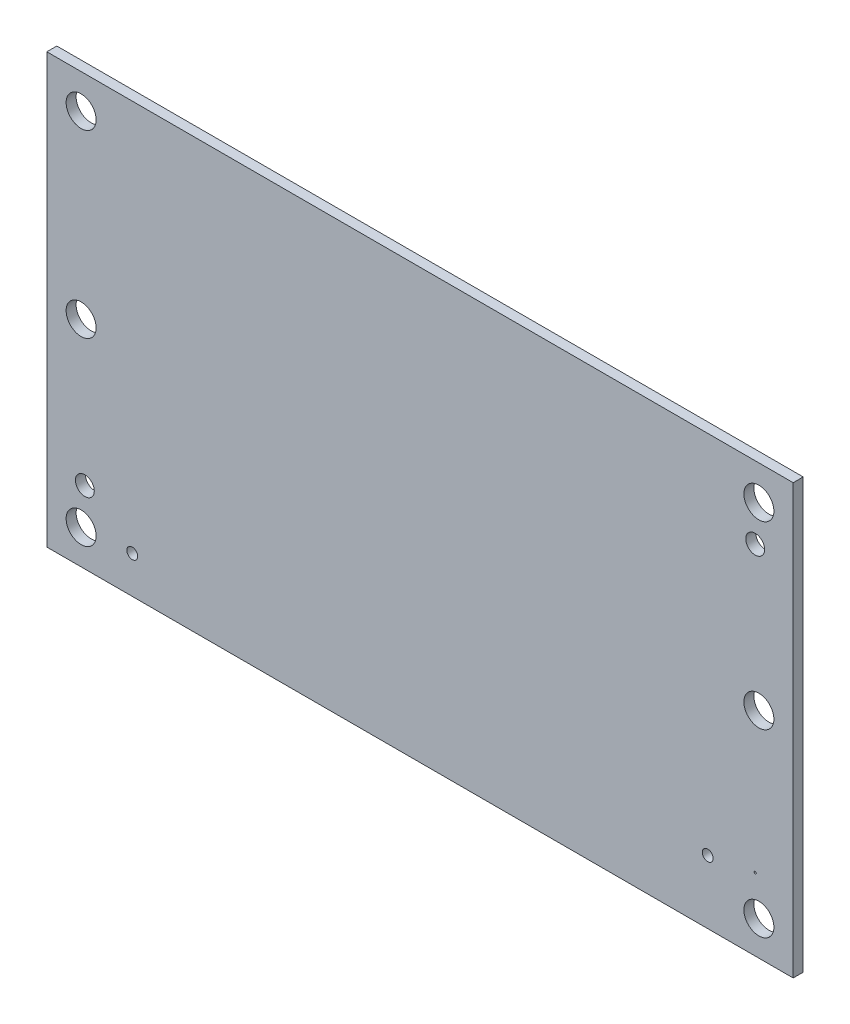
ISO-10303-21;
HEADER;
FILE_DESCRIPTION(('STEP AP214'),'2;1');
FILE_NAME('part.step','',(''),(''),'','','');
FILE_SCHEMA(('AUTOMOTIVE_DESIGN { 1 0 10303 214 1 1 1 1 }'));
ENDSEC;
DATA;
#1=APPLICATION_CONTEXT('core data for automotive mechanical design processes');
#2=APPLICATION_PROTOCOL_DEFINITION('international standard','automotive_design',2000,#1);
#3=PRODUCT_CONTEXT('',#1,'mechanical');
#4=PRODUCT('Part','Part','',(#3));
#5=PRODUCT_RELATED_PRODUCT_CATEGORY('part','',(#4));
#6=PRODUCT_DEFINITION_FORMATION('','',#4);
#7=PRODUCT_DEFINITION_CONTEXT('part definition',#1,'design');
#8=PRODUCT_DEFINITION('design','',#6,#7);
#9=PRODUCT_DEFINITION_SHAPE('','',#8);
#10=(LENGTH_UNIT() NAMED_UNIT(*) SI_UNIT(.MILLI.,.METRE.));
#11=(NAMED_UNIT(*) PLANE_ANGLE_UNIT() SI_UNIT($,.RADIAN.));
#12=(NAMED_UNIT(*) SI_UNIT($,.STERADIAN.) SOLID_ANGLE_UNIT());
#13=UNCERTAINTY_MEASURE_WITH_UNIT(LENGTH_MEASURE(1.E-05),#10,'distance_accuracy_value','');
#14=(GEOMETRIC_REPRESENTATION_CONTEXT(3) GLOBAL_UNCERTAINTY_ASSIGNED_CONTEXT((#13)) GLOBAL_UNIT_ASSIGNED_CONTEXT((#10,
#11,#12)) REPRESENTATION_CONTEXT('',''));
#15=CARTESIAN_POINT('',(0.,0.,0.));
#16=DIRECTION('',(0.,0.,1.));
#17=DIRECTION('',(1.,0.,0.));
#18=AXIS2_PLACEMENT_3D('',#15,#16,#17);
#19=CARTESIAN_POINT('',(0.,0.,1.16399999999992));
#20=DIRECTION('',(0.,0.,1.));
#21=DIRECTION('',(1.,0.,0.));
#22=AXIS2_PLACEMENT_3D('',#19,#20,#21);
#23=PLANE('',#22);
#24=CARTESIAN_POINT('',(5.9599999926,0.3500000112,1.16399999999992));
#25=DIRECTION('',(0.,0.,1.));
#26=DIRECTION('',(1.,0.,0.));
#27=AXIS2_PLACEMENT_3D('',#24,#25,#26);
#28=CIRCLE('',#27,0.635);
#29=CARTESIAN_POINT('',(6.5949999926,0.3500000112,1.16399999999992));
#30=VERTEX_POINT('',#29);
#31=EDGE_CURVE('E113',#30,#30,#28,.F.);
#32=ORIENTED_EDGE('',*,*,#31,.T.);
#33=EDGE_LOOP('',(#32));
#34=FACE_BOUND('',#33,.T.);
#35=CARTESIAN_POINT('',(73.0399999954,3.4000000072,1.16399999999992));
#36=DIRECTION('',(0.,0.,1.));
#37=DIRECTION('',(1.,0.,0.));
#38=AXIS2_PLACEMENT_3D('',#35,#36,#37);
#39=CIRCLE('',#38,0.635);
#40=CARTESIAN_POINT('',(73.6749999954,3.4000000072,1.16399999999992));
#41=VERTEX_POINT('',#40);
#42=EDGE_CURVE('E116',#41,#41,#39,.F.);
#43=ORIENTED_EDGE('',*,*,#42,.T.);
#44=EDGE_LOOP('',(#43));
#45=FACE_BOUND('',#44,.T.);
#46=CARTESIAN_POINT('',(78.5700000098,4.4300000046,1.16399999999992));
#47=DIRECTION('',(0.,0.,1.));
#48=DIRECTION('',(1.,0.,0.));
#49=AXIS2_PLACEMENT_3D('',#46,#47,#48);
#50=CIRCLE('',#49,0.125000004);
#51=CARTESIAN_POINT('',(78.6950000138,4.4300000046,1.16399999999992));
#52=VERTEX_POINT('',#51);
#53=EDGE_CURVE('E119',#52,#52,#50,.F.);
#54=ORIENTED_EDGE('',*,*,#53,.T.);
#55=EDGE_LOOP('',(#54));
#56=FACE_BOUND('',#55,.T.);
#57=CARTESIAN_POINT('',(78.5700000098,37.5799999986,1.16399999999992));
#58=DIRECTION('',(0.,0.,1.));
#59=DIRECTION('',(1.,0.,0.));
#60=AXIS2_PLACEMENT_3D('',#57,#58,#59);
#61=CIRCLE('',#60,1.0999999971);
#62=CARTESIAN_POINT('',(79.6700000069,37.5799999986,1.16399999999992));
#63=VERTEX_POINT('',#62);
#64=EDGE_CURVE('E122',#63,#63,#61,.F.);
#65=ORIENTED_EDGE('',*,*,#64,.T.);
#66=EDGE_LOOP('',(#65));
#67=FACE_BOUND('',#66,.T.);
#68=CARTESIAN_POINT('',(0.4319999996,4.4180000032,1.16399999999992));
#69=DIRECTION('',(0.,0.,1.));
#70=DIRECTION('',(1.,0.,0.));
#71=AXIS2_PLACEMENT_3D('',#68,#69,#70);
#72=CIRCLE('',#71,1.0999999971);
#73=CARTESIAN_POINT('',(1.5319999967,4.4180000032,1.16399999999992));
#74=VERTEX_POINT('',#73);
#75=EDGE_CURVE('E125',#74,#74,#72,.F.);
#76=ORIENTED_EDGE('',*,*,#75,.T.);
#77=EDGE_LOOP('',(#76));
#78=FACE_BOUND('',#77,.T.);
#79=CARTESIAN_POINT('',(78.999999988,41.9999999978,1.16399999999992));
#80=DIRECTION('',(0.,0.,1.));
#81=DIRECTION('',(1.,0.,0.));
#82=AXIS2_PLACEMENT_3D('',#79,#80,#81);
#83=CIRCLE('',#82,1.7500000052);
#84=CARTESIAN_POINT('',(80.7499999932,41.9999999978,1.16399999999992));
#85=VERTEX_POINT('',#84);
#86=EDGE_CURVE('E128',#85,#85,#83,.F.);
#87=ORIENTED_EDGE('',*,*,#86,.T.);
#88=EDGE_LOOP('',(#87));
#89=FACE_BOUND('',#88,.T.);
#90=CARTESIAN_POINT('',(78.999999988,21.0000000116,1.16399999999992));
#91=DIRECTION('',(0.,0.,1.));
#92=DIRECTION('',(1.,0.,0.));
#93=AXIS2_PLACEMENT_3D('',#90,#91,#92);
#94=CIRCLE('',#93,1.7500000052);
#95=CARTESIAN_POINT('',(80.7499999932,21.0000000116,1.16399999999992));
#96=VERTEX_POINT('',#95);
#97=EDGE_CURVE('E131',#96,#96,#94,.F.);
#98=ORIENTED_EDGE('',*,*,#97,.T.);
#99=EDGE_LOOP('',(#98));
#100=FACE_BOUND('',#99,.T.);
#101=CARTESIAN_POINT('',(78.999999988,0.,1.16399999999992));
#102=DIRECTION('',(0.,0.,1.));
#103=DIRECTION('',(1.,0.,0.));
#104=AXIS2_PLACEMENT_3D('',#101,#102,#103);
#105=CIRCLE('',#104,1.7500000052);
#106=CARTESIAN_POINT('',(80.7499999932,0.,1.16399999999992));
#107=VERTEX_POINT('',#106);
#108=EDGE_CURVE('E134',#107,#107,#105,.F.);
#109=ORIENTED_EDGE('',*,*,#108,.T.);
#110=EDGE_LOOP('',(#109));
#111=FACE_BOUND('',#110,.T.);
#112=CARTESIAN_POINT('',(0.,41.9999999978,1.16399999999992));
#113=DIRECTION('',(0.,0.,1.));
#114=DIRECTION('',(1.,0.,0.));
#115=AXIS2_PLACEMENT_3D('',#112,#113,#114);
#116=CIRCLE('',#115,1.7500000052);
#117=CARTESIAN_POINT('',(1.7500000052,41.9999999978,1.16399999999992));
#118=VERTEX_POINT('',#117);
#119=EDGE_CURVE('E137',#118,#118,#116,.F.);
#120=ORIENTED_EDGE('',*,*,#119,.T.);
#121=EDGE_LOOP('',(#120));
#122=FACE_BOUND('',#121,.T.);
#123=CARTESIAN_POINT('',(0.,21.0000000116,1.16399999999992));
#124=DIRECTION('',(0.,0.,1.));
#125=DIRECTION('',(1.,0.,0.));
#126=AXIS2_PLACEMENT_3D('',#123,#124,#125);
#127=CIRCLE('',#126,1.7500000052);
#128=CARTESIAN_POINT('',(1.7500000052,21.0000000116,1.16399999999992));
#129=VERTEX_POINT('',#128);
#130=EDGE_CURVE('E139',#129,#129,#127,.F.);
#131=ORIENTED_EDGE('',*,*,#130,.T.);
#132=EDGE_LOOP('',(#131));
#133=FACE_BOUND('',#132,.T.);
#134=CARTESIAN_POINT('',(0.,0.,1.16399999999992));
#135=DIRECTION('',(0.,0.,1.));
#136=DIRECTION('',(1.,0.,0.));
#137=AXIS2_PLACEMENT_3D('',#134,#135,#136);
#138=CIRCLE('',#137,1.7500000052);
#139=CARTESIAN_POINT('',(1.7500000052,0.,1.16399999999992));
#140=VERTEX_POINT('',#139);
#141=EDGE_CURVE('E20',#140,#140,#138,.F.);
#142=ORIENTED_EDGE('',*,*,#141,.T.);
#143=EDGE_LOOP('',(#142));
#144=FACE_BOUND('',#143,.T.);
#145=DIRECTION('',(0.,1.,0.));
#146=VECTOR('',#145,1.);
#147=CARTESIAN_POINT('',(-3.99999999999924,45.9999999999938,1.16399999999992));
#148=LINE('',#147,#146);
#149=CARTESIAN_POINT('',(-3.99999999999924,-3.99999999999924,1.16399999999992));
#150=VERTEX_POINT('',#149);
#151=CARTESIAN_POINT('',(-3.99999999999924,45.9999999999938,1.16399999999992));
#152=VERTEX_POINT('',#151);
#153=EDGE_CURVE('E71',#150,#152,#148,.T.);
#154=ORIENTED_EDGE('',*,*,#153,.F.);
#155=DIRECTION('',(1.,0.,0.));
#156=VECTOR('',#155,1.);
#157=CARTESIAN_POINT('',(-3.99999999999924,-3.99999999999924,1.16399999999992));
#158=LINE('',#157,#156);
#159=CARTESIAN_POINT('',(82.9999999999982,-3.99999999999924,1.16399999999992));
#160=VERTEX_POINT('',#159);
#161=EDGE_CURVE('E68',#160,#150,#158,.F.);
#162=ORIENTED_EDGE('',*,*,#161,.F.);
#163=DIRECTION('',(0.,1.,0.));
#164=VECTOR('',#163,1.);
#165=CARTESIAN_POINT('',(82.9999999999982,-3.99999999999924,1.16399999999992));
#166=LINE('',#165,#164);
#167=CARTESIAN_POINT('',(82.9999999999982,45.9999999999938,1.16399999999992));
#168=VERTEX_POINT('',#167);
#169=EDGE_CURVE('E59',#168,#160,#166,.F.);
#170=ORIENTED_EDGE('',*,*,#169,.F.);
#171=DIRECTION('',(1.,0.,0.));
#172=VECTOR('',#171,1.);
#173=CARTESIAN_POINT('',(82.9999999999982,45.9999999999938,1.16399999999992));
#174=LINE('',#173,#172);
#175=EDGE_CURVE('E54',#152,#168,#174,.T.);
#176=ORIENTED_EDGE('',*,*,#175,.F.);
#177=EDGE_LOOP('',(#154,#162,#170,#176));
#178=FACE_BOUND('',#177,.T.);
#179=ADVANCED_FACE('F17',(#34,#45,#56,#67,#78,#89,#100,#111,#122,#133,#144,#178),#23,.T.);
#180=CARTESIAN_POINT('',(-3.99999999999924,-3.99999999999924,0.));
#181=DIRECTION('',(0.,-1.,0.));
#182=DIRECTION('',(0.,0.,-1.));
#183=AXIS2_PLACEMENT_3D('',#180,#181,#182);
#184=PLANE('',#183);
#185=DIRECTION('',(0.,0.,1.));
#186=VECTOR('',#185,1.);
#187=CARTESIAN_POINT('',(-3.99999999999924,-3.99999999999924,0.));
#188=LINE('',#187,#186);
#189=CARTESIAN_POINT('',(-3.99999999999924,-3.99999999999924,0.));
#190=VERTEX_POINT('',#189);
#191=EDGE_CURVE('E147',#190,#150,#188,.T.);
#192=ORIENTED_EDGE('',*,*,#191,.F.);
#193=DIRECTION('',(1.,0.,0.));
#194=VECTOR('',#193,1.);
#195=CARTESIAN_POINT('',(0.,-3.99999999999924,0.));
#196=LINE('',#195,#194);
#197=CARTESIAN_POINT('',(82.9999999999982,-3.99999999999924,0.));
#198=VERTEX_POINT('',#197);
#199=EDGE_CURVE('E78',#190,#198,#196,.T.);
#200=ORIENTED_EDGE('',*,*,#199,.T.);
#201=DIRECTION('',(0.,0.,-1.));
#202=VECTOR('',#201,1.);
#203=CARTESIAN_POINT('',(82.9999999999982,-3.99999999999924,0.));
#204=LINE('',#203,#202);
#205=EDGE_CURVE('E64',#160,#198,#204,.T.);
#206=ORIENTED_EDGE('',*,*,#205,.F.);
#207=ORIENTED_EDGE('',*,*,#161,.T.);
#208=EDGE_LOOP('',(#192,#200,#206,#207));
#209=FACE_BOUND('',#208,.T.);
#210=ADVANCED_FACE('F77',(#209),#184,.T.);
#211=CARTESIAN_POINT('',(82.9999999999982,-3.99999999999924,0.));
#212=DIRECTION('',(1.,0.,0.));
#213=DIRECTION('',(0.,0.,-1.));
#214=AXIS2_PLACEMENT_3D('',#211,#212,#213);
#215=PLANE('',#214);
#216=ORIENTED_EDGE('',*,*,#205,.T.);
#217=DIRECTION('',(0.,1.,0.));
#218=VECTOR('',#217,1.);
#219=CARTESIAN_POINT('',(82.9999999999982,0.,0.));
#220=LINE('',#219,#218);
#221=CARTESIAN_POINT('',(82.9999999999982,45.9999999999938,0.));
#222=VERTEX_POINT('',#221);
#223=EDGE_CURVE('E158',#198,#222,#220,.T.);
#224=ORIENTED_EDGE('',*,*,#223,.T.);
#225=DIRECTION('',(0.,0.,1.));
#226=VECTOR('',#225,1.);
#227=CARTESIAN_POINT('',(82.9999999999982,45.9999999999938,0.));
#228=LINE('',#227,#226);
#229=EDGE_CURVE('E66',#168,#222,#228,.F.);
#230=ORIENTED_EDGE('',*,*,#229,.F.);
#231=ORIENTED_EDGE('',*,*,#169,.T.);
#232=EDGE_LOOP('',(#216,#224,#230,#231));
#233=FACE_BOUND('',#232,.T.);
#234=ADVANCED_FACE('F61',(#233),#215,.T.);
#235=CARTESIAN_POINT('',(82.9999999999982,45.9999999999938,0.));
#236=DIRECTION('',(0.,1.,0.));
#237=DIRECTION('',(0.,0.,1.));
#238=AXIS2_PLACEMENT_3D('',#235,#236,#237);
#239=PLANE('',#238);
#240=ORIENTED_EDGE('',*,*,#229,.T.);
#241=DIRECTION('',(1.,0.,0.));
#242=VECTOR('',#241,1.);
#243=CARTESIAN_POINT('',(0.,45.9999999999938,0.));
#244=LINE('',#243,#242);
#245=CARTESIAN_POINT('',(-3.99999999999924,45.9999999999938,0.));
#246=VERTEX_POINT('',#245);
#247=EDGE_CURVE('E155',#222,#246,#244,.F.);
#248=ORIENTED_EDGE('',*,*,#247,.T.);
#249=DIRECTION('',(0.,0.,1.));
#250=VECTOR('',#249,1.);
#251=CARTESIAN_POINT('',(-3.99999999999924,45.9999999999938,0.));
#252=LINE('',#251,#250);
#253=EDGE_CURVE('E35',#152,#246,#252,.F.);
#254=ORIENTED_EDGE('',*,*,#253,.F.);
#255=ORIENTED_EDGE('',*,*,#175,.T.);
#256=EDGE_LOOP('',(#240,#248,#254,#255));
#257=FACE_BOUND('',#256,.T.);
#258=ADVANCED_FACE('F154',(#257),#239,.T.);
#259=CARTESIAN_POINT('',(-3.99999999999924,45.9999999999938,0.));
#260=DIRECTION('',(-1.,0.,0.));
#261=DIRECTION('',(0.,0.,1.));
#262=AXIS2_PLACEMENT_3D('',#259,#260,#261);
#263=PLANE('',#262);
#264=ORIENTED_EDGE('',*,*,#253,.T.);
#265=DIRECTION('',(0.,1.,0.));
#266=VECTOR('',#265,1.);
#267=CARTESIAN_POINT('',(-3.99999999999924,0.,0.));
#268=LINE('',#267,#266);
#269=EDGE_CURVE('E112',#246,#190,#268,.F.);
#270=ORIENTED_EDGE('',*,*,#269,.T.);
#271=ORIENTED_EDGE('',*,*,#191,.T.);
#272=ORIENTED_EDGE('',*,*,#153,.T.);
#273=EDGE_LOOP('',(#264,#270,#271,#272));
#274=FACE_BOUND('',#273,.T.);
#275=ADVANCED_FACE('F161',(#274),#263,.T.);
#276=CARTESIAN_POINT('',(0.,0.,0.));
#277=DIRECTION('',(0.,0.,1.));
#278=DIRECTION('',(1.,0.,0.));
#279=AXIS2_PLACEMENT_3D('',#276,#277,#278);
#280=CYLINDRICAL_SURFACE('',#279,1.7500000052);
#281=ORIENTED_EDGE('',*,*,#141,.F.);
#282=EDGE_LOOP('',(#281));
#283=FACE_BOUND('',#282,.T.);
#284=CARTESIAN_POINT('',(0.,0.,0.));
#285=DIRECTION('',(0.,0.,1.));
#286=DIRECTION('',(1.,0.,0.));
#287=AXIS2_PLACEMENT_3D('',#284,#285,#286);
#288=CIRCLE('',#287,1.7500000052);
#289=CARTESIAN_POINT('',(1.7500000052,0.,0.));
#290=VERTEX_POINT('',#289);
#291=EDGE_CURVE('E109',#290,#290,#288,.F.);
#292=ORIENTED_EDGE('',*,*,#291,.T.);
#293=EDGE_LOOP('',(#292));
#294=FACE_BOUND('',#293,.T.);
#295=ADVANCED_FACE('F163',(#283,#294),#280,.F.);
#296=CARTESIAN_POINT('',(0.,21.0000000116,0.));
#297=DIRECTION('',(0.,0.,1.));
#298=DIRECTION('',(1.,0.,0.));
#299=AXIS2_PLACEMENT_3D('',#296,#297,#298);
#300=CYLINDRICAL_SURFACE('',#299,1.7500000052);
#301=ORIENTED_EDGE('',*,*,#130,.F.);
#302=EDGE_LOOP('',(#301));
#303=FACE_BOUND('',#302,.T.);
#304=CARTESIAN_POINT('',(0.,21.0000000116,0.));
#305=DIRECTION('',(0.,0.,1.));
#306=DIRECTION('',(1.,0.,0.));
#307=AXIS2_PLACEMENT_3D('',#304,#305,#306);
#308=CIRCLE('',#307,1.7500000052);
#309=CARTESIAN_POINT('',(1.7500000052,21.0000000116,0.));
#310=VERTEX_POINT('',#309);
#311=EDGE_CURVE('E106',#310,#310,#308,.F.);
#312=ORIENTED_EDGE('',*,*,#311,.T.);
#313=EDGE_LOOP('',(#312));
#314=FACE_BOUND('',#313,.T.);
#315=ADVANCED_FACE('F170',(#303,#314),#300,.F.);
#316=CARTESIAN_POINT('',(0.,41.9999999978,0.));
#317=DIRECTION('',(0.,0.,1.));
#318=DIRECTION('',(1.,0.,0.));
#319=AXIS2_PLACEMENT_3D('',#316,#317,#318);
#320=CYLINDRICAL_SURFACE('',#319,1.7500000052);
#321=ORIENTED_EDGE('',*,*,#119,.F.);
#322=EDGE_LOOP('',(#321));
#323=FACE_BOUND('',#322,.T.);
#324=CARTESIAN_POINT('',(0.,41.9999999978,0.));
#325=DIRECTION('',(0.,0.,1.));
#326=DIRECTION('',(1.,0.,0.));
#327=AXIS2_PLACEMENT_3D('',#324,#325,#326);
#328=CIRCLE('',#327,1.7500000052);
#329=CARTESIAN_POINT('',(1.7500000052,41.9999999978,0.));
#330=VERTEX_POINT('',#329);
#331=EDGE_CURVE('E103',#330,#330,#328,.F.);
#332=ORIENTED_EDGE('',*,*,#331,.T.);
#333=EDGE_LOOP('',(#332));
#334=FACE_BOUND('',#333,.T.);
#335=ADVANCED_FACE('F213',(#323,#334),#320,.F.);
#336=CARTESIAN_POINT('',(78.999999988,0.,0.));
#337=DIRECTION('',(0.,0.,1.));
#338=DIRECTION('',(1.,0.,0.));
#339=AXIS2_PLACEMENT_3D('',#336,#337,#338);
#340=CYLINDRICAL_SURFACE('',#339,1.7500000052);
#341=ORIENTED_EDGE('',*,*,#108,.F.);
#342=EDGE_LOOP('',(#341));
#343=FACE_BOUND('',#342,.T.);
#344=CARTESIAN_POINT('',(78.999999988,0.,0.));
#345=DIRECTION('',(0.,0.,1.));
#346=DIRECTION('',(1.,0.,0.));
#347=AXIS2_PLACEMENT_3D('',#344,#345,#346);
#348=CIRCLE('',#347,1.7500000052);
#349=CARTESIAN_POINT('',(80.7499999932,0.,0.));
#350=VERTEX_POINT('',#349);
#351=EDGE_CURVE('E100',#350,#350,#348,.F.);
#352=ORIENTED_EDGE('',*,*,#351,.T.);
#353=EDGE_LOOP('',(#352));
#354=FACE_BOUND('',#353,.T.);
#355=ADVANCED_FACE('F209',(#343,#354),#340,.F.);
#356=CARTESIAN_POINT('',(78.999999988,21.0000000116,0.));
#357=DIRECTION('',(0.,0.,1.));
#358=DIRECTION('',(1.,0.,0.));
#359=AXIS2_PLACEMENT_3D('',#356,#357,#358);
#360=CYLINDRICAL_SURFACE('',#359,1.7500000052);
#361=ORIENTED_EDGE('',*,*,#97,.F.);
#362=EDGE_LOOP('',(#361));
#363=FACE_BOUND('',#362,.T.);
#364=CARTESIAN_POINT('',(78.999999988,21.0000000116,0.));
#365=DIRECTION('',(0.,0.,1.));
#366=DIRECTION('',(1.,0.,0.));
#367=AXIS2_PLACEMENT_3D('',#364,#365,#366);
#368=CIRCLE('',#367,1.7500000052);
#369=CARTESIAN_POINT('',(80.7499999932,21.0000000116,0.));
#370=VERTEX_POINT('',#369);
#371=EDGE_CURVE('E97',#370,#370,#368,.F.);
#372=ORIENTED_EDGE('',*,*,#371,.T.);
#373=EDGE_LOOP('',(#372));
#374=FACE_BOUND('',#373,.T.);
#375=ADVANCED_FACE('F205',(#363,#374),#360,.F.);
#376=CARTESIAN_POINT('',(78.999999988,41.9999999978,0.));
#377=DIRECTION('',(0.,0.,1.));
#378=DIRECTION('',(1.,0.,0.));
#379=AXIS2_PLACEMENT_3D('',#376,#377,#378);
#380=CYLINDRICAL_SURFACE('',#379,1.7500000052);
#381=ORIENTED_EDGE('',*,*,#86,.F.);
#382=EDGE_LOOP('',(#381));
#383=FACE_BOUND('',#382,.T.);
#384=CARTESIAN_POINT('',(78.999999988,41.9999999978,0.));
#385=DIRECTION('',(0.,0.,1.));
#386=DIRECTION('',(1.,0.,0.));
#387=AXIS2_PLACEMENT_3D('',#384,#385,#386);
#388=CIRCLE('',#387,1.7500000052);
#389=CARTESIAN_POINT('',(80.7499999932,41.9999999978,0.));
#390=VERTEX_POINT('',#389);
#391=EDGE_CURVE('E94',#390,#390,#388,.F.);
#392=ORIENTED_EDGE('',*,*,#391,.T.);
#393=EDGE_LOOP('',(#392));
#394=FACE_BOUND('',#393,.T.);
#395=ADVANCED_FACE('F201',(#383,#394),#380,.F.);
#396=CARTESIAN_POINT('',(0.4319999996,4.4180000032,0.));
#397=DIRECTION('',(0.,0.,1.));
#398=DIRECTION('',(1.,0.,0.));
#399=AXIS2_PLACEMENT_3D('',#396,#397,#398);
#400=CYLINDRICAL_SURFACE('',#399,1.0999999971);
#401=ORIENTED_EDGE('',*,*,#75,.F.);
#402=EDGE_LOOP('',(#401));
#403=FACE_BOUND('',#402,.T.);
#404=CARTESIAN_POINT('',(0.4319999996,4.4180000032,0.));
#405=DIRECTION('',(0.,0.,1.));
#406=DIRECTION('',(1.,0.,0.));
#407=AXIS2_PLACEMENT_3D('',#404,#405,#406);
#408=CIRCLE('',#407,1.0999999971);
#409=CARTESIAN_POINT('',(1.5319999967,4.4180000032,0.));
#410=VERTEX_POINT('',#409);
#411=EDGE_CURVE('E91',#410,#410,#408,.F.);
#412=ORIENTED_EDGE('',*,*,#411,.T.);
#413=EDGE_LOOP('',(#412));
#414=FACE_BOUND('',#413,.T.);
#415=ADVANCED_FACE('F197',(#403,#414),#400,.F.);
#416=CARTESIAN_POINT('',(78.5700000098,37.5799999986,0.));
#417=DIRECTION('',(0.,0.,1.));
#418=DIRECTION('',(1.,0.,0.));
#419=AXIS2_PLACEMENT_3D('',#416,#417,#418);
#420=CYLINDRICAL_SURFACE('',#419,1.0999999971);
#421=ORIENTED_EDGE('',*,*,#64,.F.);
#422=EDGE_LOOP('',(#421));
#423=FACE_BOUND('',#422,.T.);
#424=CARTESIAN_POINT('',(78.5700000098,37.5799999986,0.));
#425=DIRECTION('',(0.,0.,1.));
#426=DIRECTION('',(1.,0.,0.));
#427=AXIS2_PLACEMENT_3D('',#424,#425,#426);
#428=CIRCLE('',#427,1.0999999971);
#429=CARTESIAN_POINT('',(79.6700000069,37.5799999986,0.));
#430=VERTEX_POINT('',#429);
#431=EDGE_CURVE('E88',#430,#430,#428,.F.);
#432=ORIENTED_EDGE('',*,*,#431,.T.);
#433=EDGE_LOOP('',(#432));
#434=FACE_BOUND('',#433,.T.);
#435=ADVANCED_FACE('F193',(#423,#434),#420,.F.);
#436=CARTESIAN_POINT('',(78.5700000098,4.4300000046,0.));
#437=DIRECTION('',(0.,0.,1.));
#438=DIRECTION('',(1.,0.,0.));
#439=AXIS2_PLACEMENT_3D('',#436,#437,#438);
#440=CYLINDRICAL_SURFACE('',#439,0.125000004);
#441=ORIENTED_EDGE('',*,*,#53,.F.);
#442=EDGE_LOOP('',(#441));
#443=FACE_BOUND('',#442,.T.);
#444=CARTESIAN_POINT('',(78.5700000098,4.4300000046,0.));
#445=DIRECTION('',(0.,0.,1.));
#446=DIRECTION('',(1.,0.,0.));
#447=AXIS2_PLACEMENT_3D('',#444,#445,#446);
#448=CIRCLE('',#447,0.125000004);
#449=CARTESIAN_POINT('',(78.6950000138,4.4300000046,0.));
#450=VERTEX_POINT('',#449);
#451=EDGE_CURVE('E85',#450,#450,#448,.F.);
#452=ORIENTED_EDGE('',*,*,#451,.T.);
#453=EDGE_LOOP('',(#452));
#454=FACE_BOUND('',#453,.T.);
#455=ADVANCED_FACE('F189',(#443,#454),#440,.F.);
#456=CARTESIAN_POINT('',(73.0399999954,3.4000000072,0.));
#457=DIRECTION('',(0.,0.,1.));
#458=DIRECTION('',(1.,0.,0.));
#459=AXIS2_PLACEMENT_3D('',#456,#457,#458);
#460=CYLINDRICAL_SURFACE('',#459,0.635);
#461=ORIENTED_EDGE('',*,*,#42,.F.);
#462=EDGE_LOOP('',(#461));
#463=FACE_BOUND('',#462,.T.);
#464=CARTESIAN_POINT('',(73.0399999954,3.4000000072,0.));
#465=DIRECTION('',(0.,0.,1.));
#466=DIRECTION('',(1.,0.,0.));
#467=AXIS2_PLACEMENT_3D('',#464,#465,#466);
#468=CIRCLE('',#467,0.635);
#469=CARTESIAN_POINT('',(73.6749999954,3.4000000072,0.));
#470=VERTEX_POINT('',#469);
#471=EDGE_CURVE('E26',#470,#470,#468,.F.);
#472=ORIENTED_EDGE('',*,*,#471,.T.);
#473=EDGE_LOOP('',(#472));
#474=FACE_BOUND('',#473,.T.);
#475=ADVANCED_FACE('F181',(#463,#474),#460,.F.);
#476=CARTESIAN_POINT('',(5.9599999926,0.3500000112,0.));
#477=DIRECTION('',(0.,0.,1.));
#478=DIRECTION('',(1.,0.,0.));
#479=AXIS2_PLACEMENT_3D('',#476,#477,#478);
#480=CYLINDRICAL_SURFACE('',#479,0.635);
#481=ORIENTED_EDGE('',*,*,#31,.F.);
#482=EDGE_LOOP('',(#481));
#483=FACE_BOUND('',#482,.T.);
#484=CARTESIAN_POINT('',(5.9599999926,0.3500000112,0.));
#485=DIRECTION('',(0.,0.,1.));
#486=DIRECTION('',(1.,0.,0.));
#487=AXIS2_PLACEMENT_3D('',#484,#485,#486);
#488=CIRCLE('',#487,0.635);
#489=CARTESIAN_POINT('',(6.5949999926,0.3500000112,0.));
#490=VERTEX_POINT('',#489);
#491=EDGE_CURVE('E11',#490,#490,#488,.F.);
#492=ORIENTED_EDGE('',*,*,#491,.T.);
#493=EDGE_LOOP('',(#492));
#494=FACE_BOUND('',#493,.T.);
#495=ADVANCED_FACE('F175',(#483,#494),#480,.F.);
#496=CARTESIAN_POINT('',(0.,0.,0.));
#497=DIRECTION('',(0.,0.,1.));
#498=DIRECTION('',(1.,0.,0.));
#499=AXIS2_PLACEMENT_3D('',#496,#497,#498);
#500=PLANE('',#499);
#501=ORIENTED_EDGE('',*,*,#491,.F.);
#502=EDGE_LOOP('',(#501));
#503=FACE_BOUND('',#502,.T.);
#504=ORIENTED_EDGE('',*,*,#471,.F.);
#505=EDGE_LOOP('',(#504));
#506=FACE_BOUND('',#505,.T.);
#507=ORIENTED_EDGE('',*,*,#451,.F.);
#508=EDGE_LOOP('',(#507));
#509=FACE_BOUND('',#508,.T.);
#510=ORIENTED_EDGE('',*,*,#431,.F.);
#511=EDGE_LOOP('',(#510));
#512=FACE_BOUND('',#511,.T.);
#513=ORIENTED_EDGE('',*,*,#411,.F.);
#514=EDGE_LOOP('',(#513));
#515=FACE_BOUND('',#514,.T.);
#516=ORIENTED_EDGE('',*,*,#391,.F.);
#517=EDGE_LOOP('',(#516));
#518=FACE_BOUND('',#517,.T.);
#519=ORIENTED_EDGE('',*,*,#371,.F.);
#520=EDGE_LOOP('',(#519));
#521=FACE_BOUND('',#520,.T.);
#522=ORIENTED_EDGE('',*,*,#351,.F.);
#523=EDGE_LOOP('',(#522));
#524=FACE_BOUND('',#523,.T.);
#525=ORIENTED_EDGE('',*,*,#331,.F.);
#526=EDGE_LOOP('',(#525));
#527=FACE_BOUND('',#526,.T.);
#528=ORIENTED_EDGE('',*,*,#311,.F.);
#529=EDGE_LOOP('',(#528));
#530=FACE_BOUND('',#529,.T.);
#531=ORIENTED_EDGE('',*,*,#291,.F.);
#532=EDGE_LOOP('',(#531));
#533=FACE_BOUND('',#532,.T.);
#534=ORIENTED_EDGE('',*,*,#247,.F.);
#535=ORIENTED_EDGE('',*,*,#223,.F.);
#536=ORIENTED_EDGE('',*,*,#199,.F.);
#537=ORIENTED_EDGE('',*,*,#269,.F.);
#538=EDGE_LOOP('',(#534,#535,#536,#537));
#539=FACE_BOUND('',#538,.T.);
#540=ADVANCED_FACE('F157',(#503,#506,#509,#512,#515,#518,#521,#524,#527,#530,#533,#539),#500,.F.);
#541=CLOSED_SHELL('',(#179,#210,#234,#258,#275,#295,#315,#335,#355,#375,#395,#415,#435,#455,
#475,#495,#540));
#542=MANIFOLD_SOLID_BREP('B1',#541);
#543=ADVANCED_BREP_SHAPE_REPRESENTATION('',(#18,#542),#14);
#544=SHAPE_DEFINITION_REPRESENTATION(#9,#543);
ENDSEC;
END-ISO-10303-21;
